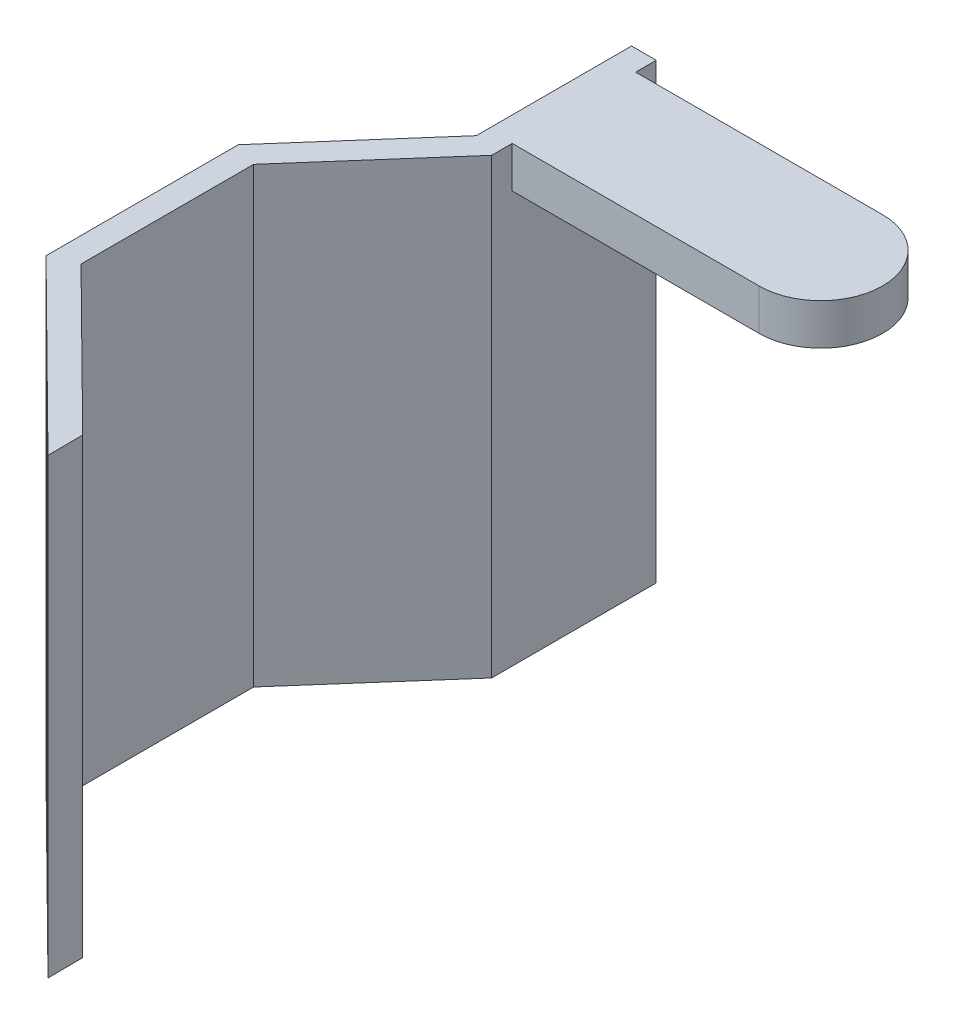
ISO-10303-21;
HEADER;
FILE_DESCRIPTION(('STEP AP214'),'2;1');
FILE_NAME('part.step','',(''),(''),'','','');
FILE_SCHEMA(('AUTOMOTIVE_DESIGN { 1 0 10303 214 1 1 1 1 }'));
ENDSEC;
DATA;
#1=APPLICATION_CONTEXT('core data for automotive mechanical design processes');
#2=APPLICATION_PROTOCOL_DEFINITION('international standard','automotive_design',2000,#1);
#3=PRODUCT_CONTEXT('',#1,'mechanical');
#4=PRODUCT('Part','Part','',(#3));
#5=PRODUCT_RELATED_PRODUCT_CATEGORY('part','',(#4));
#6=PRODUCT_DEFINITION_FORMATION('','',#4);
#7=PRODUCT_DEFINITION_CONTEXT('part definition',#1,'design');
#8=PRODUCT_DEFINITION('design','',#6,#7);
#9=PRODUCT_DEFINITION_SHAPE('','',#8);
#10=(LENGTH_UNIT() NAMED_UNIT(*) SI_UNIT(.MILLI.,.METRE.));
#11=(NAMED_UNIT(*) PLANE_ANGLE_UNIT() SI_UNIT($,.RADIAN.));
#12=(NAMED_UNIT(*) SI_UNIT($,.STERADIAN.) SOLID_ANGLE_UNIT());
#13=UNCERTAINTY_MEASURE_WITH_UNIT(LENGTH_MEASURE(1.E-05),#10,'distance_accuracy_value','');
#14=(GEOMETRIC_REPRESENTATION_CONTEXT(3) GLOBAL_UNCERTAINTY_ASSIGNED_CONTEXT((#13)) GLOBAL_UNIT_ASSIGNED_CONTEXT((#10,
#11,#12)) REPRESENTATION_CONTEXT('',''));
#15=CARTESIAN_POINT('',(0.,0.,0.));
#16=DIRECTION('',(0.,0.,1.));
#17=DIRECTION('',(1.,0.,0.));
#18=AXIS2_PLACEMENT_3D('',#15,#16,#17);
#19=CARTESIAN_POINT('',(0.,55.,0.));
#20=DIRECTION('',(0.,0.,-1.));
#21=DIRECTION('',(1.,0.,0.));
#22=AXIS2_PLACEMENT_3D('',#19,#20,#21);
#23=PLANE('',#22);
#24=DIRECTION('',(-1.,0.,0.));
#25=VECTOR('',#24,1.);
#26=CARTESIAN_POINT('',(0.,0.,0.));
#27=LINE('',#26,#25);
#28=CARTESIAN_POINT('',(3.,0.,0.));
#29=VERTEX_POINT('',#28);
#30=CARTESIAN_POINT('',(0.,0.,0.));
#31=VERTEX_POINT('',#30);
#32=EDGE_CURVE('E161',#29,#31,#27,.T.);
#33=ORIENTED_EDGE('',*,*,#32,.T.);
#34=DIRECTION('',(0.,-1.,0.));
#35=VECTOR('',#34,1.);
#36=CARTESIAN_POINT('',(0.,55.,0.));
#37=LINE('',#36,#35);
#38=CARTESIAN_POINT('',(0.,55.,0.));
#39=VERTEX_POINT('',#38);
#40=EDGE_CURVE('E160',#39,#31,#37,.T.);
#41=ORIENTED_EDGE('',*,*,#40,.F.);
#42=DIRECTION('',(-1.,0.,0.));
#43=VECTOR('',#42,1.);
#44=CARTESIAN_POINT('',(0.,55.,0.));
#45=LINE('',#44,#43);
#46=CARTESIAN_POINT('',(3.,55.,0.));
#47=VERTEX_POINT('',#46);
#48=EDGE_CURVE('E186',#47,#39,#45,.T.);
#49=ORIENTED_EDGE('',*,*,#48,.F.);
#50=DIRECTION('',(0.,-1.,0.));
#51=VECTOR('',#50,1.);
#52=CARTESIAN_POINT('',(3.,55.,0.));
#53=LINE('',#52,#51);
#54=EDGE_CURVE('E11',#47,#29,#53,.T.);
#55=ORIENTED_EDGE('',*,*,#54,.T.);
#56=EDGE_LOOP('',(#33,#41,#49,#55));
#57=FACE_BOUND('',#56,.T.);
#58=ADVANCED_FACE('F39',(#57),#23,.T.);
#59=CARTESIAN_POINT('',(3.,55.,0.));
#60=DIRECTION('',(-1.,0.,0.));
#61=DIRECTION('',(0.,0.,-1.));
#62=AXIS2_PLACEMENT_3D('',#59,#60,#61);
#63=PLANE('',#62);
#64=DIRECTION('',(0.,0.,1.));
#65=VECTOR('',#64,1.);
#66=CARTESIAN_POINT('',(3.,55.,0.));
#67=LINE('',#66,#65);
#68=CARTESIAN_POINT('',(3.,55.,17.5));
#69=VERTEX_POINT('',#68);
#70=CARTESIAN_POINT('',(3.,55.,20.));
#71=VERTEX_POINT('',#70);
#72=EDGE_CURVE('E207',#69,#71,#67,.T.);
#73=ORIENTED_EDGE('',*,*,#72,.T.);
#74=DIRECTION('',(0.,-1.,0.));
#75=VECTOR('',#74,1.);
#76=CARTESIAN_POINT('',(3.,55.,20.));
#77=LINE('',#76,#75);
#78=CARTESIAN_POINT('',(3.,0.,20.));
#79=VERTEX_POINT('',#78);
#80=EDGE_CURVE('E46',#71,#79,#77,.T.);
#81=ORIENTED_EDGE('',*,*,#80,.T.);
#82=DIRECTION('',(0.,0.,1.));
#83=VECTOR('',#82,1.);
#84=CARTESIAN_POINT('',(3.,0.,0.));
#85=LINE('',#84,#83);
#86=EDGE_CURVE('E164',#29,#79,#85,.T.);
#87=ORIENTED_EDGE('',*,*,#86,.F.);
#88=ORIENTED_EDGE('',*,*,#54,.F.);
#89=CARTESIAN_POINT('',(3.,55.,2.5));
#90=VERTEX_POINT('',#89);
#91=EDGE_CURVE('E108',#47,#90,#67,.T.);
#92=ORIENTED_EDGE('',*,*,#91,.T.);
#93=DIRECTION('',(0.,1.,0.));
#94=VECTOR('',#93,1.);
#95=CARTESIAN_POINT('',(3.,50.,2.5));
#96=LINE('',#95,#94);
#97=CARTESIAN_POINT('',(3.,50.,2.5));
#98=VERTEX_POINT('',#97);
#99=EDGE_CURVE('E222',#98,#90,#96,.T.);
#100=ORIENTED_EDGE('',*,*,#99,.F.);
#101=DIRECTION('',(0.,0.,-1.));
#102=VECTOR('',#101,1.);
#103=CARTESIAN_POINT('',(3.,50.,0.));
#104=LINE('',#103,#102);
#105=CARTESIAN_POINT('',(3.,50.,17.5));
#106=VERTEX_POINT('',#105);
#107=EDGE_CURVE('E251',#106,#98,#104,.T.);
#108=ORIENTED_EDGE('',*,*,#107,.F.);
#109=DIRECTION('',(0.,1.,0.));
#110=VECTOR('',#109,1.);
#111=CARTESIAN_POINT('',(3.,50.,17.5));
#112=LINE('',#111,#110);
#113=EDGE_CURVE('E165',#106,#69,#112,.T.);
#114=ORIENTED_EDGE('',*,*,#113,.T.);
#115=EDGE_LOOP('',(#73,#81,#87,#88,#92,#100,#108,#114));
#116=FACE_BOUND('',#115,.T.);
#117=ADVANCED_FACE('F205',(#116),#63,.F.);
#118=CARTESIAN_POINT('',(11.6103440031896,55.,10.1759094573042));
#119=DIRECTION('',(-0.752035287081566,0.,-0.659122846656181));
#120=DIRECTION('',(0.659122846656181,0.,-0.752035287081566));
#121=AXIS2_PLACEMENT_3D('',#118,#119,#120);
#122=PLANE('',#121);
#123=DIRECTION('',(-0.659122846656181,0.,0.752035287081566));
#124=VECTOR('',#123,1.);
#125=CARTESIAN_POINT('',(11.6103440031896,0.,10.1759094573042));
#126=LINE('',#125,#124);
#127=CARTESIAN_POINT('',(-10.505514798512,0.,35.409303061196));
#128=VERTEX_POINT('',#127);
#129=EDGE_CURVE('E168',#79,#128,#126,.T.);
#130=ORIENTED_EDGE('',*,*,#129,.F.);
#131=ORIENTED_EDGE('',*,*,#80,.F.);
#132=DIRECTION('',(-0.659122846656181,0.,0.752035287081566));
#133=VECTOR('',#132,1.);
#134=CARTESIAN_POINT('',(11.6103440031896,55.,10.1759094573042));
#135=LINE('',#134,#133);
#136=CARTESIAN_POINT('',(-10.505514798512,55.,35.409303061196));
#137=VERTEX_POINT('',#136);
#138=EDGE_CURVE('E211',#71,#137,#135,.T.);
#139=ORIENTED_EDGE('',*,*,#138,.T.);
#140=DIRECTION('',(0.,-1.,0.));
#141=VECTOR('',#140,1.);
#142=CARTESIAN_POINT('',(-10.505514798512,55.,35.409303061196));
#143=LINE('',#142,#141);
#144=EDGE_CURVE('E199',#137,#128,#143,.T.);
#145=ORIENTED_EDGE('',*,*,#144,.T.);
#146=EDGE_LOOP('',(#130,#131,#139,#145));
#147=FACE_BOUND('',#146,.T.);
#148=ADVANCED_FACE('F210',(#147),#122,.F.);
#149=CARTESIAN_POINT('',(-10.505514798512,55.,0.));
#150=DIRECTION('',(-1.,0.,0.));
#151=DIRECTION('',(0.,0.,-1.));
#152=AXIS2_PLACEMENT_3D('',#149,#150,#151);
#153=PLANE('',#152);
#154=DIRECTION('',(0.,0.,1.));
#155=VECTOR('',#154,1.);
#156=CARTESIAN_POINT('',(-10.505514798512,0.,0.));
#157=LINE('',#156,#155);
#158=CARTESIAN_POINT('',(-10.505514798512,0.,56.3844767940236));
#159=VERTEX_POINT('',#158);
#160=EDGE_CURVE('E171',#128,#159,#157,.T.);
#161=ORIENTED_EDGE('',*,*,#160,.F.);
#162=ORIENTED_EDGE('',*,*,#144,.F.);
#163=DIRECTION('',(0.,0.,1.));
#164=VECTOR('',#163,1.);
#165=CARTESIAN_POINT('',(-10.505514798512,55.,0.));
#166=LINE('',#165,#164);
#167=CARTESIAN_POINT('',(-10.505514798512,55.,56.3844767940236));
#168=VERTEX_POINT('',#167);
#169=EDGE_CURVE('E226',#137,#168,#166,.T.);
#170=ORIENTED_EDGE('',*,*,#169,.T.);
#171=DIRECTION('',(0.,-1.,0.));
#172=VECTOR('',#171,1.);
#173=CARTESIAN_POINT('',(-10.505514798512,55.,56.3844767940236));
#174=LINE('',#173,#172);
#175=EDGE_CURVE('E196',#168,#159,#174,.T.);
#176=ORIENTED_EDGE('',*,*,#175,.T.);
#177=EDGE_LOOP('',(#161,#162,#170,#176));
#178=FACE_BOUND('',#177,.T.);
#179=ADVANCED_FACE('F247',(#178),#153,.F.);
#180=CARTESIAN_POINT('',(-33.3838448037325,55.,33.7632066765023));
#181=DIRECTION('',(-0.70310060646766,0.,0.711090386086614));
#182=DIRECTION('',(-0.711090386086614,0.,-0.70310060646766));
#183=AXIS2_PLACEMENT_3D('',#180,#181,#182);
#184=PLANE('',#183);
#185=DIRECTION('',(0.711090386086614,0.,0.70310060646766));
#186=VECTOR('',#185,1.);
#187=CARTESIAN_POINT('',(-33.3838448037325,0.,33.7632066765023));
#188=LINE('',#187,#186);
#189=CARTESIAN_POINT('',(7.59252972399853,0.,74.2791725016744));
#190=VERTEX_POINT('',#189);
#191=EDGE_CURVE('E174',#159,#190,#188,.T.);
#192=ORIENTED_EDGE('',*,*,#191,.F.);
#193=ORIENTED_EDGE('',*,*,#175,.F.);
#194=DIRECTION('',(0.711090386086614,0.,0.70310060646766));
#195=VECTOR('',#194,1.);
#196=CARTESIAN_POINT('',(-33.3838448037325,55.,33.7632066765023));
#197=LINE('',#196,#195);
#198=CARTESIAN_POINT('',(7.59252972399853,55.,74.2791725016744));
#199=VERTEX_POINT('',#198);
#200=EDGE_CURVE('E233',#168,#199,#197,.T.);
#201=ORIENTED_EDGE('',*,*,#200,.T.);
#202=DIRECTION('',(0.,-1.,0.));
#203=VECTOR('',#202,1.);
#204=CARTESIAN_POINT('',(7.59252972399853,55.,74.2791725016744));
#205=LINE('',#204,#203);
#206=EDGE_CURVE('E193',#199,#190,#205,.T.);
#207=ORIENTED_EDGE('',*,*,#206,.T.);
#208=EDGE_LOOP('',(#192,#193,#201,#207));
#209=FACE_BOUND('',#208,.T.);
#210=ADVANCED_FACE('F245',(#209),#184,.F.);
#211=CARTESIAN_POINT('',(7.17264443633418,55.,-0.0405234148945547));
#212=DIRECTION('',(-0.999984040728061,0.,0.00564962734874768));
#213=DIRECTION('',(-0.00564962734874768,0.,-0.999984040728061));
#214=AXIS2_PLACEMENT_3D('',#211,#212,#213);
#215=PLANE('',#214);
#216=DIRECTION('',(0.00564962734874768,0.,0.999984040728061));
#217=VECTOR('',#216,1.);
#218=CARTESIAN_POINT('',(7.17264443633418,0.,-0.0405234148945547));
#219=LINE('',#218,#217);
#220=CARTESIAN_POINT('',(7.61649906285539,0.,78.5217454793372));
#221=VERTEX_POINT('',#220);
#222=EDGE_CURVE('E177',#190,#221,#219,.T.);
#223=ORIENTED_EDGE('',*,*,#222,.F.);
#224=ORIENTED_EDGE('',*,*,#206,.F.);
#225=DIRECTION('',(0.00564962734874768,0.,0.999984040728061));
#226=VECTOR('',#225,1.);
#227=CARTESIAN_POINT('',(7.17264443633418,55.,-0.0405234148945547));
#228=LINE('',#227,#226);
#229=CARTESIAN_POINT('',(7.61649906285539,55.,78.5217454793372));
#230=VERTEX_POINT('',#229);
#231=EDGE_CURVE('E155',#199,#230,#228,.T.);
#232=ORIENTED_EDGE('',*,*,#231,.T.);
#233=DIRECTION('',(0.,-1.,0.));
#234=VECTOR('',#233,1.);
#235=CARTESIAN_POINT('',(7.61649906285539,55.,78.5217454793372));
#236=LINE('',#235,#234);
#237=EDGE_CURVE('E190',#230,#221,#236,.T.);
#238=ORIENTED_EDGE('',*,*,#237,.T.);
#239=EDGE_LOOP('',(#223,#224,#232,#238));
#240=FACE_BOUND('',#239,.T.);
#241=ADVANCED_FACE('F238',(#240),#215,.F.);
#242=CARTESIAN_POINT('',(-35.4931466231355,55.,35.8964778347622));
#243=DIRECTION('',(-0.70310060646766,0.,0.711090386086614));
#244=DIRECTION('',(-0.711090386086614,0.,-0.70310060646766));
#245=AXIS2_PLACEMENT_3D('',#242,#243,#244);
#246=PLANE('',#245);
#247=DIRECTION('',(0.711090386086614,0.,0.70310060646766));
#248=VECTOR('',#247,1.);
#249=CARTESIAN_POINT('',(-35.4931466231355,0.,35.8964778347622));
#250=LINE('',#249,#248);
#251=CARTESIAN_POINT('',(-13.505514798512,0.,57.6370576164122));
#252=VERTEX_POINT('',#251);
#253=EDGE_CURVE('E180',#252,#221,#250,.T.);
#254=ORIENTED_EDGE('',*,*,#253,.T.);
#255=ORIENTED_EDGE('',*,*,#237,.F.);
#256=DIRECTION('',(0.711090386086614,0.,0.70310060646766));
#257=VECTOR('',#256,1.);
#258=CARTESIAN_POINT('',(-35.4931466231355,55.,35.8964778347622));
#259=LINE('',#258,#257);
#260=CARTESIAN_POINT('',(-13.505514798512,55.,57.6370576164122));
#261=VERTEX_POINT('',#260);
#262=EDGE_CURVE('E153',#261,#230,#259,.T.);
#263=ORIENTED_EDGE('',*,*,#262,.F.);
#264=DIRECTION('',(0.,-1.,0.));
#265=VECTOR('',#264,1.);
#266=CARTESIAN_POINT('',(-13.505514798512,55.,57.6370576164122));
#267=LINE('',#266,#265);
#268=EDGE_CURVE('E147',#261,#252,#267,.T.);
#269=ORIENTED_EDGE('',*,*,#268,.T.);
#270=EDGE_LOOP('',(#254,#255,#263,#269));
#271=FACE_BOUND('',#270,.T.);
#272=ADVANCED_FACE('F242',(#271),#246,.T.);
#273=CARTESIAN_POINT('',(-13.505514798512,55.,0.));
#274=DIRECTION('',(-1.,0.,0.));
#275=DIRECTION('',(0.,0.,-1.));
#276=AXIS2_PLACEMENT_3D('',#273,#274,#275);
#277=PLANE('',#276);
#278=DIRECTION('',(0.,0.,1.));
#279=VECTOR('',#278,1.);
#280=CARTESIAN_POINT('',(-13.505514798512,0.,0.));
#281=LINE('',#280,#279);
#282=CARTESIAN_POINT('',(-13.505514798512,0.,34.2806907812103));
#283=VERTEX_POINT('',#282);
#284=EDGE_CURVE('E182',#283,#252,#281,.T.);
#285=ORIENTED_EDGE('',*,*,#284,.T.);
#286=ORIENTED_EDGE('',*,*,#268,.F.);
#287=DIRECTION('',(0.,0.,1.));
#288=VECTOR('',#287,1.);
#289=CARTESIAN_POINT('',(-13.505514798512,55.,0.));
#290=LINE('',#289,#288);
#291=CARTESIAN_POINT('',(-13.505514798512,55.,34.2806907812103));
#292=VERTEX_POINT('',#291);
#293=EDGE_CURVE('E136',#292,#261,#290,.T.);
#294=ORIENTED_EDGE('',*,*,#293,.F.);
#295=DIRECTION('',(0.,-1.,0.));
#296=VECTOR('',#295,1.);
#297=CARTESIAN_POINT('',(-13.505514798512,55.,34.2806907812103));
#298=LINE('',#297,#296);
#299=EDGE_CURVE('E142',#292,#283,#298,.T.);
#300=ORIENTED_EDGE('',*,*,#299,.T.);
#301=EDGE_LOOP('',(#285,#286,#294,#300));
#302=FACE_BOUND('',#301,.T.);
#303=ADVANCED_FACE('F150',(#302),#277,.T.);
#304=CARTESIAN_POINT('',(9.35423814194485,55.,8.19854091733569));
#305=DIRECTION('',(-0.752035287081566,0.,-0.659122846656181));
#306=DIRECTION('',(0.659122846656181,0.,-0.752035287081566));
#307=AXIS2_PLACEMENT_3D('',#304,#305,#306);
#308=PLANE('',#307);
#309=DIRECTION('',(-0.659122846656181,0.,0.752035287081566));
#310=VECTOR('',#309,1.);
#311=CARTESIAN_POINT('',(9.35423814194485,0.,8.19854091733569));
#312=LINE('',#311,#310);
#313=CARTESIAN_POINT('',(0.,0.,18.8713877200143));
#314=VERTEX_POINT('',#313);
#315=EDGE_CURVE('E144',#314,#283,#312,.T.);
#316=ORIENTED_EDGE('',*,*,#315,.T.);
#317=ORIENTED_EDGE('',*,*,#299,.F.);
#318=DIRECTION('',(-0.659122846656181,0.,0.752035287081566));
#319=VECTOR('',#318,1.);
#320=CARTESIAN_POINT('',(9.35423814194485,55.,8.19854091733569));
#321=LINE('',#320,#319);
#322=CARTESIAN_POINT('',(0.,55.,18.8713877200143));
#323=VERTEX_POINT('',#322);
#324=EDGE_CURVE('E132',#323,#292,#321,.T.);
#325=ORIENTED_EDGE('',*,*,#324,.F.);
#326=DIRECTION('',(0.,-1.,0.));
#327=VECTOR('',#326,1.);
#328=CARTESIAN_POINT('',(0.,55.,18.8713877200143));
#329=LINE('',#328,#327);
#330=EDGE_CURVE('E148',#323,#314,#329,.T.);
#331=ORIENTED_EDGE('',*,*,#330,.T.);
#332=EDGE_LOOP('',(#316,#317,#325,#331));
#333=FACE_BOUND('',#332,.T.);
#334=ADVANCED_FACE('F143',(#333),#308,.T.);
#335=CARTESIAN_POINT('',(0.,55.,0.));
#336=DIRECTION('',(-1.,0.,0.));
#337=DIRECTION('',(0.,0.,-1.));
#338=AXIS2_PLACEMENT_3D('',#335,#336,#337);
#339=PLANE('',#338);
#340=DIRECTION('',(0.,0.,1.));
#341=VECTOR('',#340,1.);
#342=CARTESIAN_POINT('',(0.,0.,0.));
#343=LINE('',#342,#341);
#344=EDGE_CURVE('E101',#31,#314,#343,.T.);
#345=ORIENTED_EDGE('',*,*,#344,.T.);
#346=ORIENTED_EDGE('',*,*,#330,.F.);
#347=DIRECTION('',(0.,0.,1.));
#348=VECTOR('',#347,1.);
#349=CARTESIAN_POINT('',(0.,55.,0.));
#350=LINE('',#349,#348);
#351=EDGE_CURVE('E62',#39,#323,#350,.T.);
#352=ORIENTED_EDGE('',*,*,#351,.F.);
#353=ORIENTED_EDGE('',*,*,#40,.T.);
#354=EDGE_LOOP('',(#345,#346,#352,#353));
#355=FACE_BOUND('',#354,.T.);
#356=ADVANCED_FACE('F321',(#355),#339,.T.);
#357=CARTESIAN_POINT('',(0.,55.,0.));
#358=DIRECTION('',(0.,1.,0.));
#359=DIRECTION('',(0.,0.,-1.));
#360=AXIS2_PLACEMENT_3D('',#357,#358,#359);
#361=PLANE('',#360);
#362=ORIENTED_EDGE('',*,*,#48,.T.);
#363=ORIENTED_EDGE('',*,*,#351,.T.);
#364=ORIENTED_EDGE('',*,*,#324,.T.);
#365=ORIENTED_EDGE('',*,*,#293,.T.);
#366=ORIENTED_EDGE('',*,*,#262,.T.);
#367=ORIENTED_EDGE('',*,*,#231,.F.);
#368=ORIENTED_EDGE('',*,*,#200,.F.);
#369=ORIENTED_EDGE('',*,*,#169,.F.);
#370=ORIENTED_EDGE('',*,*,#138,.F.);
#371=ORIENTED_EDGE('',*,*,#72,.F.);
#372=DIRECTION('',(-1.,0.,0.));
#373=VECTOR('',#372,1.);
#374=CARTESIAN_POINT('',(0.,55.,17.5));
#375=LINE('',#374,#373);
#376=CARTESIAN_POINT('',(33.,55.,17.5));
#377=VERTEX_POINT('',#376);
#378=EDGE_CURVE('E53',#377,#69,#375,.T.);
#379=ORIENTED_EDGE('',*,*,#378,.F.);
#380=CARTESIAN_POINT('',(33.,55.,10.));
#381=DIRECTION('',(0.,-1.,0.));
#382=DIRECTION('',(0.,0.,-1.));
#383=AXIS2_PLACEMENT_3D('',#380,#381,#382);
#384=CIRCLE('',#383,7.5);
#385=CARTESIAN_POINT('',(33.,55.,2.5));
#386=VERTEX_POINT('',#385);
#387=EDGE_CURVE('E250',#386,#377,#384,.T.);
#388=ORIENTED_EDGE('',*,*,#387,.F.);
#389=DIRECTION('',(-1.,0.,0.));
#390=VECTOR('',#389,1.);
#391=CARTESIAN_POINT('',(0.,55.,2.5));
#392=LINE('',#391,#390);
#393=EDGE_CURVE('E256',#386,#90,#392,.T.);
#394=ORIENTED_EDGE('',*,*,#393,.T.);
#395=ORIENTED_EDGE('',*,*,#91,.F.);
#396=EDGE_LOOP('',(#362,#363,#364,#365,#366,#367,#368,#369,#370,#371,#379,#388,#394,#395));
#397=FACE_BOUND('',#396,.T.);
#398=ADVANCED_FACE('F134',(#397),#361,.T.);
#399=CARTESIAN_POINT('',(0.,0.,0.));
#400=DIRECTION('',(0.,1.,0.));
#401=DIRECTION('',(0.,0.,-1.));
#402=AXIS2_PLACEMENT_3D('',#399,#400,#401);
#403=PLANE('',#402);
#404=ORIENTED_EDGE('',*,*,#32,.F.);
#405=ORIENTED_EDGE('',*,*,#86,.T.);
#406=ORIENTED_EDGE('',*,*,#129,.T.);
#407=ORIENTED_EDGE('',*,*,#160,.T.);
#408=ORIENTED_EDGE('',*,*,#191,.T.);
#409=ORIENTED_EDGE('',*,*,#222,.T.);
#410=ORIENTED_EDGE('',*,*,#253,.F.);
#411=ORIENTED_EDGE('',*,*,#284,.F.);
#412=ORIENTED_EDGE('',*,*,#315,.F.);
#413=ORIENTED_EDGE('',*,*,#344,.F.);
#414=EDGE_LOOP('',(#404,#405,#406,#407,#408,#409,#410,#411,#412,#413));
#415=FACE_BOUND('',#414,.T.);
#416=ADVANCED_FACE('F213',(#415),#403,.F.);
#417=CARTESIAN_POINT('',(0.,50.,17.5));
#418=DIRECTION('',(0.,0.,1.));
#419=DIRECTION('',(-1.,0.,0.));
#420=AXIS2_PLACEMENT_3D('',#417,#418,#419);
#421=PLANE('',#420);
#422=ORIENTED_EDGE('',*,*,#378,.T.);
#423=ORIENTED_EDGE('',*,*,#113,.F.);
#424=DIRECTION('',(-1.,0.,0.));
#425=VECTOR('',#424,1.);
#426=CARTESIAN_POINT('',(0.,50.,17.5));
#427=LINE('',#426,#425);
#428=CARTESIAN_POINT('',(33.,50.,17.5));
#429=VERTEX_POINT('',#428);
#430=EDGE_CURVE('E265',#429,#106,#427,.T.);
#431=ORIENTED_EDGE('',*,*,#430,.F.);
#432=DIRECTION('',(0.,1.,0.));
#433=VECTOR('',#432,1.);
#434=CARTESIAN_POINT('',(33.,50.,17.5));
#435=LINE('',#434,#433);
#436=EDGE_CURVE('E261',#429,#377,#435,.T.);
#437=ORIENTED_EDGE('',*,*,#436,.T.);
#438=EDGE_LOOP('',(#422,#423,#431,#437));
#439=FACE_BOUND('',#438,.T.);
#440=ADVANCED_FACE('F289',(#439),#421,.T.);
#441=CARTESIAN_POINT('',(33.,50.,10.));
#442=DIRECTION('',(0.,1.,0.));
#443=DIRECTION('',(0.,0.,-1.));
#444=AXIS2_PLACEMENT_3D('',#441,#442,#443);
#445=CYLINDRICAL_SURFACE('',#444,7.5);
#446=ORIENTED_EDGE('',*,*,#387,.T.);
#447=ORIENTED_EDGE('',*,*,#436,.F.);
#448=CARTESIAN_POINT('',(33.,50.,10.));
#449=DIRECTION('',(0.,-1.,0.));
#450=DIRECTION('',(0.,0.,-1.));
#451=AXIS2_PLACEMENT_3D('',#448,#449,#450);
#452=CIRCLE('',#451,7.5);
#453=CARTESIAN_POINT('',(33.,50.,2.5));
#454=VERTEX_POINT('',#453);
#455=EDGE_CURVE('E270',#454,#429,#452,.T.);
#456=ORIENTED_EDGE('',*,*,#455,.F.);
#457=DIRECTION('',(0.,1.,0.));
#458=VECTOR('',#457,1.);
#459=CARTESIAN_POINT('',(33.,50.,2.5));
#460=LINE('',#459,#458);
#461=EDGE_CURVE('E263',#454,#386,#460,.T.);
#462=ORIENTED_EDGE('',*,*,#461,.T.);
#463=EDGE_LOOP('',(#446,#447,#456,#462));
#464=FACE_BOUND('',#463,.T.);
#465=ADVANCED_FACE('F291',(#464),#445,.T.);
#466=CARTESIAN_POINT('',(0.,50.,2.5));
#467=DIRECTION('',(0.,0.,1.));
#468=DIRECTION('',(-1.,0.,0.));
#469=AXIS2_PLACEMENT_3D('',#466,#467,#468);
#470=PLANE('',#469);
#471=ORIENTED_EDGE('',*,*,#393,.F.);
#472=ORIENTED_EDGE('',*,*,#461,.F.);
#473=DIRECTION('',(-1.,0.,0.));
#474=VECTOR('',#473,1.);
#475=CARTESIAN_POINT('',(0.,50.,2.5));
#476=LINE('',#475,#474);
#477=EDGE_CURVE('E254',#454,#98,#476,.T.);
#478=ORIENTED_EDGE('',*,*,#477,.T.);
#479=ORIENTED_EDGE('',*,*,#99,.T.);
#480=EDGE_LOOP('',(#471,#472,#478,#479));
#481=FACE_BOUND('',#480,.T.);
#482=ADVANCED_FACE('F278',(#481),#470,.F.);
#483=CARTESIAN_POINT('',(33.,50.,10.));
#484=DIRECTION('',(0.,1.,0.));
#485=DIRECTION('',(0.,0.,-1.));
#486=AXIS2_PLACEMENT_3D('',#483,#484,#485);
#487=PLANE('',#486);
#488=ORIENTED_EDGE('',*,*,#107,.T.);
#489=ORIENTED_EDGE('',*,*,#477,.F.);
#490=ORIENTED_EDGE('',*,*,#455,.T.);
#491=ORIENTED_EDGE('',*,*,#430,.T.);
#492=EDGE_LOOP('',(#488,#489,#490,#491));
#493=FACE_BOUND('',#492,.T.);
#494=ADVANCED_FACE('F288',(#493),#487,.F.);
#495=CLOSED_SHELL('',(#58,#117,#148,#179,#210,#241,#272,#303,#334,#356,#398,#416,#440,#465,#482,#494));
#496=MANIFOLD_SOLID_BREP('B2',#495);
#497=ADVANCED_BREP_SHAPE_REPRESENTATION('',(#18,#496),#14);
#498=SHAPE_DEFINITION_REPRESENTATION(#9,#497);
ENDSEC;
END-ISO-10303-21;
